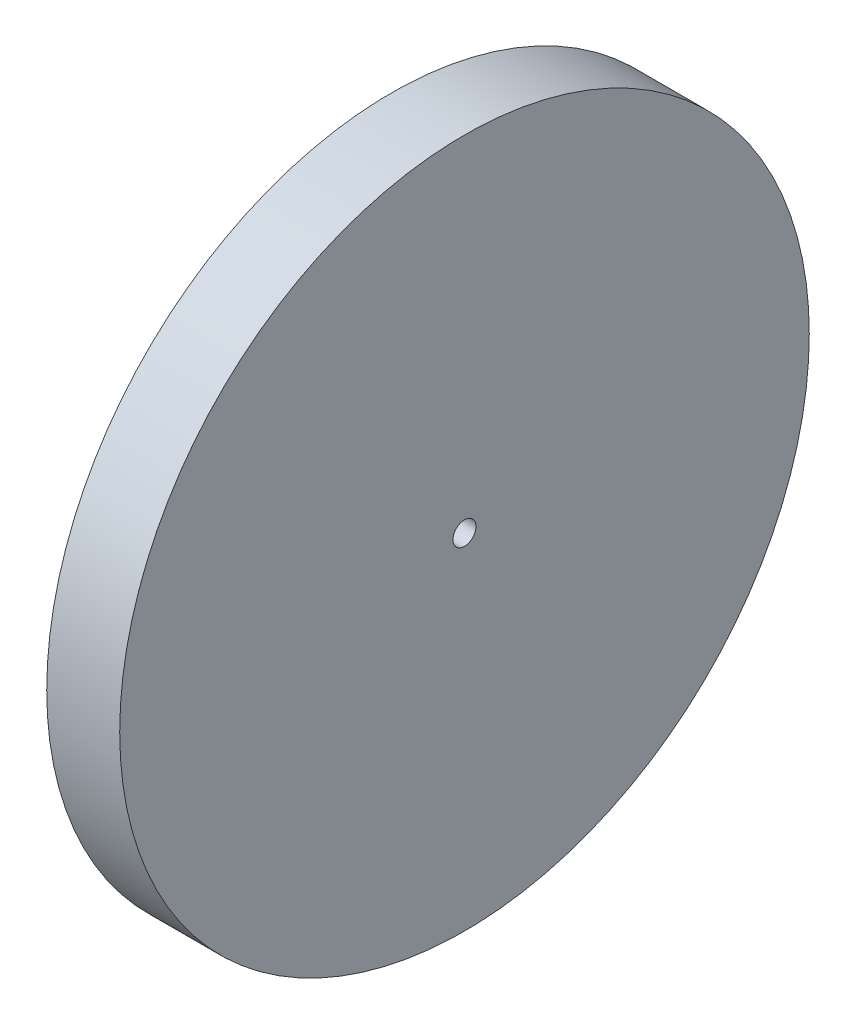
ISO-10303-21;
HEADER;
FILE_DESCRIPTION(('STEP AP214'),'2;1');
FILE_NAME('part.step','',(''),(''),'','','');
FILE_SCHEMA(('AUTOMOTIVE_DESIGN { 1 0 10303 214 1 1 1 1 }'));
ENDSEC;
DATA;
#1=APPLICATION_CONTEXT('core data for automotive mechanical design processes');
#2=APPLICATION_PROTOCOL_DEFINITION('international standard','automotive_design',2000,#1);
#3=PRODUCT_CONTEXT('',#1,'mechanical');
#4=PRODUCT('Part','Part','',(#3));
#5=PRODUCT_RELATED_PRODUCT_CATEGORY('part','',(#4));
#6=PRODUCT_DEFINITION_FORMATION('','',#4);
#7=PRODUCT_DEFINITION_CONTEXT('part definition',#1,'design');
#8=PRODUCT_DEFINITION('design','',#6,#7);
#9=PRODUCT_DEFINITION_SHAPE('','',#8);
#10=(LENGTH_UNIT() NAMED_UNIT(*) SI_UNIT(.MILLI.,.METRE.));
#11=(NAMED_UNIT(*) PLANE_ANGLE_UNIT() SI_UNIT($,.RADIAN.));
#12=(NAMED_UNIT(*) SI_UNIT($,.STERADIAN.) SOLID_ANGLE_UNIT());
#13=UNCERTAINTY_MEASURE_WITH_UNIT(LENGTH_MEASURE(1.E-05),#10,'distance_accuracy_value','');
#14=(GEOMETRIC_REPRESENTATION_CONTEXT(3) GLOBAL_UNCERTAINTY_ASSIGNED_CONTEXT((#13)) GLOBAL_UNIT_ASSIGNED_CONTEXT((#10,
#11,#12)) REPRESENTATION_CONTEXT('',''));
#15=CARTESIAN_POINT('',(0.,0.,0.));
#16=DIRECTION('',(0.,0.,1.));
#17=DIRECTION('',(1.,0.,0.));
#18=AXIS2_PLACEMENT_3D('',#15,#16,#17);
#19=CARTESIAN_POINT('',(6.35,0.,0.));
#20=DIRECTION('',(1.,0.,0.));
#21=DIRECTION('',(0.,0.,-1.));
#22=AXIS2_PLACEMENT_3D('',#19,#20,#21);
#23=PLANE('',#22);
#24=CARTESIAN_POINT('',(6.35,0.,0.));
#25=DIRECTION('',(1.,0.,0.));
#26=DIRECTION('',(0.,0.,-1.));
#27=AXIS2_PLACEMENT_3D('',#24,#25,#26);
#28=CIRCLE('',#27,30.);
#29=CARTESIAN_POINT('',(6.35,0.,-30.));
#30=VERTEX_POINT('',#29);
#31=EDGE_CURVE('E10',#30,#30,#28,.T.);
#32=ORIENTED_EDGE('',*,*,#31,.T.);
#33=EDGE_LOOP('',(#32));
#34=FACE_BOUND('',#33,.T.);
#35=CARTESIAN_POINT('',(6.35,0.,0.));
#36=DIRECTION('',(1.,0.,0.));
#37=DIRECTION('',(0.,0.,-1.));
#38=AXIS2_PLACEMENT_3D('',#35,#36,#37);
#39=CIRCLE('',#38,1.);
#40=CARTESIAN_POINT('',(6.35,0.,-1.));
#41=VERTEX_POINT('',#40);
#42=EDGE_CURVE('E41',#41,#41,#39,.T.);
#43=ORIENTED_EDGE('',*,*,#42,.F.);
#44=EDGE_LOOP('',(#43));
#45=FACE_BOUND('',#44,.T.);
#46=ADVANCED_FACE('F30',(#34,#45),#23,.T.);
#47=CARTESIAN_POINT('',(0.,0.,0.));
#48=DIRECTION('',(1.,0.,0.));
#49=DIRECTION('',(0.,0.,-1.));
#50=AXIS2_PLACEMENT_3D('',#47,#48,#49);
#51=PLANE('',#50);
#52=CARTESIAN_POINT('',(0.,0.,0.));
#53=DIRECTION('',(1.,0.,0.));
#54=DIRECTION('',(0.,0.,-1.));
#55=AXIS2_PLACEMENT_3D('',#52,#53,#54);
#56=CIRCLE('',#55,30.);
#57=CARTESIAN_POINT('',(0.,0.,-30.));
#58=VERTEX_POINT('',#57);
#59=EDGE_CURVE('E34',#58,#58,#56,.T.);
#60=ORIENTED_EDGE('',*,*,#59,.F.);
#61=EDGE_LOOP('',(#60));
#62=FACE_BOUND('',#61,.T.);
#63=CARTESIAN_POINT('',(0.,0.,0.));
#64=DIRECTION('',(1.,0.,0.));
#65=DIRECTION('',(0.,0.,-1.));
#66=AXIS2_PLACEMENT_3D('',#63,#64,#65);
#67=CIRCLE('',#66,1.);
#68=CARTESIAN_POINT('',(0.,0.,-1.));
#69=VERTEX_POINT('',#68);
#70=EDGE_CURVE('E43',#69,#69,#67,.T.);
#71=ORIENTED_EDGE('',*,*,#70,.T.);
#72=EDGE_LOOP('',(#71));
#73=FACE_BOUND('',#72,.T.);
#74=ADVANCED_FACE('F53',(#62,#73),#51,.F.);
#75=CARTESIAN_POINT('',(6.35,0.,0.));
#76=DIRECTION('',(-1.,0.,0.));
#77=DIRECTION('',(0.,0.,1.));
#78=AXIS2_PLACEMENT_3D('',#75,#76,#77);
#79=CYLINDRICAL_SURFACE('',#78,30.);
#80=ORIENTED_EDGE('',*,*,#31,.F.);
#81=EDGE_LOOP('',(#80));
#82=FACE_BOUND('',#81,.T.);
#83=ORIENTED_EDGE('',*,*,#59,.T.);
#84=EDGE_LOOP('',(#83));
#85=FACE_BOUND('',#84,.T.);
#86=ADVANCED_FACE('F32',(#82,#85),#79,.T.);
#87=CARTESIAN_POINT('',(6.35,0.,0.));
#88=DIRECTION('',(-1.,0.,0.));
#89=DIRECTION('',(0.,0.,1.));
#90=AXIS2_PLACEMENT_3D('',#87,#88,#89);
#91=CYLINDRICAL_SURFACE('',#90,1.);
#92=ORIENTED_EDGE('',*,*,#42,.T.);
#93=EDGE_LOOP('',(#92));
#94=FACE_BOUND('',#93,.T.);
#95=ORIENTED_EDGE('',*,*,#70,.F.);
#96=EDGE_LOOP('',(#95));
#97=FACE_BOUND('',#96,.T.);
#98=ADVANCED_FACE('F49',(#94,#97),#91,.F.);
#99=CLOSED_SHELL('',(#46,#74,#86,#98));
#100=MANIFOLD_SOLID_BREP('B2',#99);
#101=ADVANCED_BREP_SHAPE_REPRESENTATION('',(#18,#100),#14);
#102=SHAPE_DEFINITION_REPRESENTATION(#9,#101);
ENDSEC;
END-ISO-10303-21;
